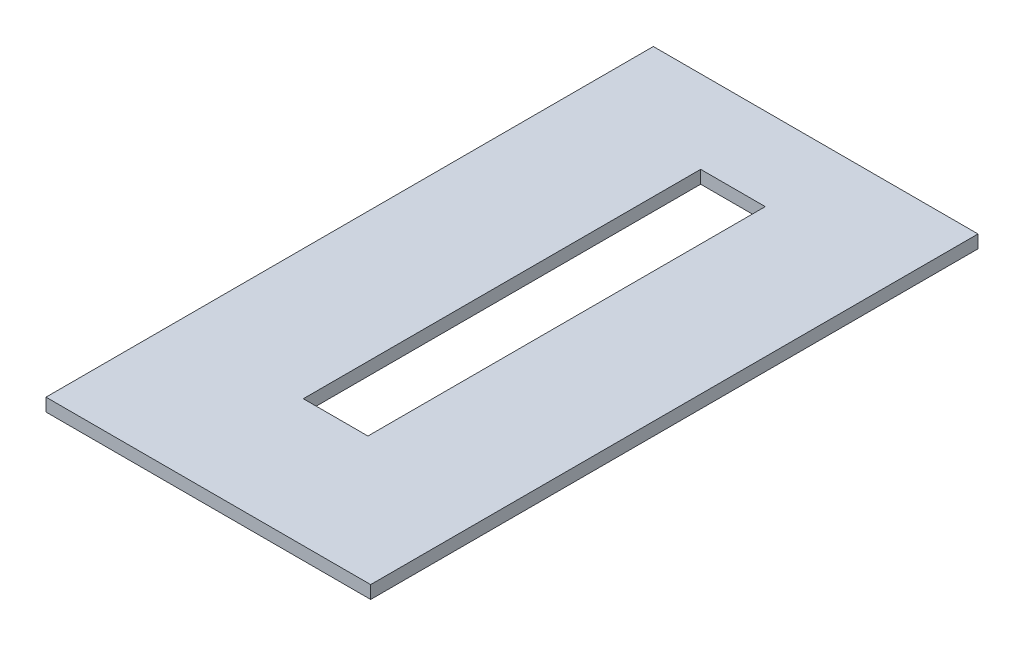
ISO-10303-21;
HEADER;
FILE_DESCRIPTION(('STEP AP214'),'2;1');
FILE_NAME('part.step','',(''),(''),'','','');
FILE_SCHEMA(('AUTOMOTIVE_DESIGN { 1 0 10303 214 1 1 1 1 }'));
ENDSEC;
DATA;
#1=APPLICATION_CONTEXT('core data for automotive mechanical design processes');
#2=APPLICATION_PROTOCOL_DEFINITION('international standard','automotive_design',2000,#1);
#3=PRODUCT_CONTEXT('',#1,'mechanical');
#4=PRODUCT('Part','Part','',(#3));
#5=PRODUCT_RELATED_PRODUCT_CATEGORY('part','',(#4));
#6=PRODUCT_DEFINITION_FORMATION('','',#4);
#7=PRODUCT_DEFINITION_CONTEXT('part definition',#1,'design');
#8=PRODUCT_DEFINITION('design','',#6,#7);
#9=PRODUCT_DEFINITION_SHAPE('','',#8);
#10=(LENGTH_UNIT() NAMED_UNIT(*) SI_UNIT(.MILLI.,.METRE.));
#11=(NAMED_UNIT(*) PLANE_ANGLE_UNIT() SI_UNIT($,.RADIAN.));
#12=(NAMED_UNIT(*) SI_UNIT($,.STERADIAN.) SOLID_ANGLE_UNIT());
#13=UNCERTAINTY_MEASURE_WITH_UNIT(LENGTH_MEASURE(1.E-05),#10,'distance_accuracy_value','');
#14=(GEOMETRIC_REPRESENTATION_CONTEXT(3) GLOBAL_UNCERTAINTY_ASSIGNED_CONTEXT((#13)) GLOBAL_UNIT_ASSIGNED_CONTEXT((#10,
#11,#12)) REPRESENTATION_CONTEXT('',''));
#15=CARTESIAN_POINT('',(0.,0.,0.));
#16=DIRECTION('',(0.,0.,1.));
#17=DIRECTION('',(1.,0.,0.));
#18=AXIS2_PLACEMENT_3D('',#15,#16,#17);
#19=CARTESIAN_POINT('',(-2512.49999999999,-10858.8285003559,4700.));
#20=DIRECTION('',(0.,0.,1.));
#21=DIRECTION('',(1.,0.,0.));
#22=AXIS2_PLACEMENT_3D('',#19,#20,#21);
#23=PLANE('',#22);
#24=DIRECTION('',(-1.,0.,0.));
#25=VECTOR('',#24,1.);
#26=CARTESIAN_POINT('',(-2512.49999999999,-199.999999999999,4700.));
#27=LINE('',#26,#25);
#28=CARTESIAN_POINT('',(2512.49999999999,-199.999999999999,4700.));
#29=VERTEX_POINT('',#28);
#30=CARTESIAN_POINT('',(-2512.49999999999,-199.999999999999,4700.));
#31=VERTEX_POINT('',#30);
#32=EDGE_CURVE('E11',#29,#31,#27,.T.);
#33=ORIENTED_EDGE('',*,*,#32,.F.);
#34=DIRECTION('',(0.,1.,0.));
#35=VECTOR('',#34,1.);
#36=CARTESIAN_POINT('',(2512.49999999999,-10858.8285003559,4700.));
#37=LINE('',#36,#35);
#38=CARTESIAN_POINT('',(2512.49999999999,0.,4700.));
#39=VERTEX_POINT('',#38);
#40=EDGE_CURVE('E145',#29,#39,#37,.T.);
#41=ORIENTED_EDGE('',*,*,#40,.T.);
#42=DIRECTION('',(1.,0.,0.));
#43=VECTOR('',#42,1.);
#44=CARTESIAN_POINT('',(-2512.49999999999,0.,4700.));
#45=LINE('',#44,#43);
#46=CARTESIAN_POINT('',(-2512.49999999999,0.,4700.));
#47=VERTEX_POINT('',#46);
#48=EDGE_CURVE('E131',#47,#39,#45,.T.);
#49=ORIENTED_EDGE('',*,*,#48,.F.);
#50=DIRECTION('',(0.,1.,0.));
#51=VECTOR('',#50,1.);
#52=CARTESIAN_POINT('',(-2512.49999999999,-10858.8285003559,4700.));
#53=LINE('',#52,#51);
#54=EDGE_CURVE('E140',#31,#47,#53,.T.);
#55=ORIENTED_EDGE('',*,*,#54,.F.);
#56=EDGE_LOOP('',(#33,#41,#49,#55));
#57=FACE_BOUND('',#56,.T.);
#58=ADVANCED_FACE('F35',(#57),#23,.T.);
#59=CARTESIAN_POINT('',(2512.49999999999,-10858.8285003559,-4700.));
#60=DIRECTION('',(1.,0.,0.));
#61=DIRECTION('',(0.,0.,-1.));
#62=AXIS2_PLACEMENT_3D('',#59,#60,#61);
#63=PLANE('',#62);
#64=DIRECTION('',(0.,0.,1.));
#65=VECTOR('',#64,1.);
#66=CARTESIAN_POINT('',(2512.49999999999,-199.999999999999,-4700.));
#67=LINE('',#66,#65);
#68=CARTESIAN_POINT('',(2512.49999999999,-199.999999999999,-4700.));
#69=VERTEX_POINT('',#68);
#70=EDGE_CURVE('E165',#69,#29,#67,.T.);
#71=ORIENTED_EDGE('',*,*,#70,.F.);
#72=DIRECTION('',(0.,1.,0.));
#73=VECTOR('',#72,1.);
#74=CARTESIAN_POINT('',(2512.49999999999,-10858.8285003559,-4700.));
#75=LINE('',#74,#73);
#76=CARTESIAN_POINT('',(2512.49999999999,0.,-4700.));
#77=VERTEX_POINT('',#76);
#78=EDGE_CURVE('E143',#69,#77,#75,.T.);
#79=ORIENTED_EDGE('',*,*,#78,.T.);
#80=DIRECTION('',(0.,0.,-1.));
#81=VECTOR('',#80,1.);
#82=CARTESIAN_POINT('',(2512.49999999999,0.,-4700.));
#83=LINE('',#82,#81);
#84=EDGE_CURVE('E134',#39,#77,#83,.T.);
#85=ORIENTED_EDGE('',*,*,#84,.F.);
#86=ORIENTED_EDGE('',*,*,#40,.F.);
#87=EDGE_LOOP('',(#71,#79,#85,#86));
#88=FACE_BOUND('',#87,.T.);
#89=ADVANCED_FACE('F190',(#88),#63,.T.);
#90=CARTESIAN_POINT('',(-2512.49999999999,-10858.8285003559,-4700.));
#91=DIRECTION('',(0.,0.,-1.));
#92=DIRECTION('',(-1.,0.,0.));
#93=AXIS2_PLACEMENT_3D('',#90,#91,#92);
#94=PLANE('',#93);
#95=DIRECTION('',(1.,0.,0.));
#96=VECTOR('',#95,1.);
#97=CARTESIAN_POINT('',(-2512.49999999999,-199.999999999999,-4700.));
#98=LINE('',#97,#96);
#99=CARTESIAN_POINT('',(-2512.49999999999,-199.999999999999,-4700.));
#100=VERTEX_POINT('',#99);
#101=EDGE_CURVE('E162',#100,#69,#98,.T.);
#102=ORIENTED_EDGE('',*,*,#101,.F.);
#103=DIRECTION('',(0.,1.,0.));
#104=VECTOR('',#103,1.);
#105=CARTESIAN_POINT('',(-2512.49999999999,-10858.8285003559,-4700.));
#106=LINE('',#105,#104);
#107=CARTESIAN_POINT('',(-2512.49999999999,0.,-4700.));
#108=VERTEX_POINT('',#107);
#109=EDGE_CURVE('E141',#100,#108,#106,.T.);
#110=ORIENTED_EDGE('',*,*,#109,.T.);
#111=DIRECTION('',(-1.,0.,0.));
#112=VECTOR('',#111,1.);
#113=CARTESIAN_POINT('',(-2512.49999999999,0.,-4700.));
#114=LINE('',#113,#112);
#115=EDGE_CURVE('E137',#77,#108,#114,.T.);
#116=ORIENTED_EDGE('',*,*,#115,.F.);
#117=ORIENTED_EDGE('',*,*,#78,.F.);
#118=EDGE_LOOP('',(#102,#110,#116,#117));
#119=FACE_BOUND('',#118,.T.);
#120=ADVANCED_FACE('F161',(#119),#94,.T.);
#121=CARTESIAN_POINT('',(-2512.49999999999,-10858.8285003559,-4700.));
#122=DIRECTION('',(-1.,0.,0.));
#123=DIRECTION('',(0.,0.,1.));
#124=AXIS2_PLACEMENT_3D('',#121,#122,#123);
#125=PLANE('',#124);
#126=DIRECTION('',(0.,0.,-1.));
#127=VECTOR('',#126,1.);
#128=CARTESIAN_POINT('',(-2512.49999999999,-199.999999999999,-4700.));
#129=LINE('',#128,#127);
#130=EDGE_CURVE('E152',#31,#100,#129,.T.);
#131=ORIENTED_EDGE('',*,*,#130,.F.);
#132=ORIENTED_EDGE('',*,*,#54,.T.);
#133=DIRECTION('',(0.,0.,1.));
#134=VECTOR('',#133,1.);
#135=CARTESIAN_POINT('',(-2512.49999999999,0.,-4700.));
#136=LINE('',#135,#134);
#137=EDGE_CURVE('E126',#108,#47,#136,.T.);
#138=ORIENTED_EDGE('',*,*,#137,.F.);
#139=ORIENTED_EDGE('',*,*,#109,.F.);
#140=EDGE_LOOP('',(#131,#132,#138,#139));
#141=FACE_BOUND('',#140,.T.);
#142=ADVANCED_FACE('F37',(#141),#125,.T.);
#143=CARTESIAN_POINT('',(0.,0.,0.));
#144=DIRECTION('',(0.,1.,0.));
#145=DIRECTION('',(0.,0.,1.));
#146=AXIS2_PLACEMENT_3D('',#143,#144,#145);
#147=PLANE('',#146);
#148=DIRECTION('',(0.,0.,1.));
#149=VECTOR('',#148,1.);
#150=CARTESIAN_POINT('',(-499.999999999778,0.,-3420.00000000009));
#151=LINE('',#150,#149);
#152=CARTESIAN_POINT('',(-499.999999999778,0.,-3420.00000000009));
#153=VERTEX_POINT('',#152);
#154=CARTESIAN_POINT('',(-499.999999999778,0.,2730.00000000002));
#155=VERTEX_POINT('',#154);
#156=EDGE_CURVE('E114',#153,#155,#151,.T.);
#157=ORIENTED_EDGE('',*,*,#156,.F.);
#158=DIRECTION('',(-1.,0.,0.));
#159=VECTOR('',#158,1.);
#160=CARTESIAN_POINT('',(-499.999999999778,0.,-3420.00000000009));
#161=LINE('',#160,#159);
#162=CARTESIAN_POINT('',(499.999999999992,0.,-3420.00000000009));
#163=VERTEX_POINT('',#162);
#164=EDGE_CURVE('E119',#163,#153,#161,.T.);
#165=ORIENTED_EDGE('',*,*,#164,.F.);
#166=DIRECTION('',(0.,0.,-1.));
#167=VECTOR('',#166,1.);
#168=CARTESIAN_POINT('',(499.999999999992,0.,-3420.00000000009));
#169=LINE('',#168,#167);
#170=CARTESIAN_POINT('',(499.999999999992,0.,2730.00000000002));
#171=VERTEX_POINT('',#170);
#172=EDGE_CURVE('E101',#171,#163,#169,.T.);
#173=ORIENTED_EDGE('',*,*,#172,.F.);
#174=DIRECTION('',(1.,0.,0.));
#175=VECTOR('',#174,1.);
#176=CARTESIAN_POINT('',(-499.999999999778,0.,2730.00000000002));
#177=LINE('',#176,#175);
#178=EDGE_CURVE('E108',#155,#171,#177,.T.);
#179=ORIENTED_EDGE('',*,*,#178,.F.);
#180=EDGE_LOOP('',(#157,#165,#173,#179));
#181=FACE_BOUND('',#180,.T.);
#182=ORIENTED_EDGE('',*,*,#137,.T.);
#183=ORIENTED_EDGE('',*,*,#48,.T.);
#184=ORIENTED_EDGE('',*,*,#84,.T.);
#185=ORIENTED_EDGE('',*,*,#115,.T.);
#186=EDGE_LOOP('',(#182,#183,#184,#185));
#187=FACE_BOUND('',#186,.T.);
#188=ADVANCED_FACE('F116',(#181,#187),#147,.T.);
#189=CARTESIAN_POINT('',(-499.999999999778,-10858.8285003559,2730.00000000002));
#190=DIRECTION('',(0.,0.,1.));
#191=DIRECTION('',(1.,0.,0.));
#192=AXIS2_PLACEMENT_3D('',#189,#190,#191);
#193=PLANE('',#192);
#194=DIRECTION('',(0.,1.,0.));
#195=VECTOR('',#194,1.);
#196=CARTESIAN_POINT('',(499.999999999992,-10858.8285003559,2730.00000000002));
#197=LINE('',#196,#195);
#198=CARTESIAN_POINT('',(499.999999999991,-199.999999999999,2730.00000000002));
#199=VERTEX_POINT('',#198);
#200=EDGE_CURVE('E97',#199,#171,#197,.T.);
#201=ORIENTED_EDGE('',*,*,#200,.F.);
#202=DIRECTION('',(-1.,0.,0.));
#203=VECTOR('',#202,1.);
#204=CARTESIAN_POINT('',(-499.999999999778,-199.999999999999,2730.00000000002));
#205=LINE('',#204,#203);
#206=CARTESIAN_POINT('',(-499.999999999778,-199.999999999999,2730.00000000002));
#207=VERTEX_POINT('',#206);
#208=EDGE_CURVE('E39',#199,#207,#205,.T.);
#209=ORIENTED_EDGE('',*,*,#208,.T.);
#210=DIRECTION('',(0.,1.,0.));
#211=VECTOR('',#210,1.);
#212=CARTESIAN_POINT('',(-499.999999999778,-10858.8285003559,2730.00000000002));
#213=LINE('',#212,#211);
#214=EDGE_CURVE('E105',#207,#155,#213,.T.);
#215=ORIENTED_EDGE('',*,*,#214,.T.);
#216=ORIENTED_EDGE('',*,*,#178,.T.);
#217=EDGE_LOOP('',(#201,#209,#215,#216));
#218=FACE_BOUND('',#217,.T.);
#219=ADVANCED_FACE('F109',(#218),#193,.F.);
#220=CARTESIAN_POINT('',(499.999999999992,-10858.8285003559,-3420.00000000009));
#221=DIRECTION('',(1.,0.,0.));
#222=DIRECTION('',(0.,0.,-1.));
#223=AXIS2_PLACEMENT_3D('',#220,#221,#222);
#224=PLANE('',#223);
#225=DIRECTION('',(0.,1.,0.));
#226=VECTOR('',#225,1.);
#227=CARTESIAN_POINT('',(499.999999999992,-10858.8285003559,-3420.00000000009));
#228=LINE('',#227,#226);
#229=CARTESIAN_POINT('',(499.999999999992,-199.999999999999,-3420.00000000009));
#230=VERTEX_POINT('',#229);
#231=EDGE_CURVE('E104',#230,#163,#228,.T.);
#232=ORIENTED_EDGE('',*,*,#231,.F.);
#233=DIRECTION('',(0.,0.,1.));
#234=VECTOR('',#233,1.);
#235=CARTESIAN_POINT('',(499.999999999992,-199.999999999999,-3420.00000000009));
#236=LINE('',#235,#234);
#237=EDGE_CURVE('E44',#230,#199,#236,.T.);
#238=ORIENTED_EDGE('',*,*,#237,.T.);
#239=ORIENTED_EDGE('',*,*,#200,.T.);
#240=ORIENTED_EDGE('',*,*,#172,.T.);
#241=EDGE_LOOP('',(#232,#238,#239,#240));
#242=FACE_BOUND('',#241,.T.);
#243=ADVANCED_FACE('F99',(#242),#224,.F.);
#244=CARTESIAN_POINT('',(-499.999999999778,-10858.8285003559,-3420.00000000009));
#245=DIRECTION('',(0.,0.,-1.));
#246=DIRECTION('',(-1.,0.,0.));
#247=AXIS2_PLACEMENT_3D('',#244,#245,#246);
#248=PLANE('',#247);
#249=DIRECTION('',(0.,1.,0.));
#250=VECTOR('',#249,1.);
#251=CARTESIAN_POINT('',(-499.999999999778,-10858.8285003559,-3420.00000000009));
#252=LINE('',#251,#250);
#253=CARTESIAN_POINT('',(-499.999999999778,-199.999999999999,-3420.00000000009));
#254=VERTEX_POINT('',#253);
#255=EDGE_CURVE('E124',#254,#153,#252,.T.);
#256=ORIENTED_EDGE('',*,*,#255,.F.);
#257=DIRECTION('',(1.,0.,0.));
#258=VECTOR('',#257,1.);
#259=CARTESIAN_POINT('',(-499.999999999778,-199.999999999999,-3420.00000000009));
#260=LINE('',#259,#258);
#261=EDGE_CURVE('E177',#254,#230,#260,.T.);
#262=ORIENTED_EDGE('',*,*,#261,.T.);
#263=ORIENTED_EDGE('',*,*,#231,.T.);
#264=ORIENTED_EDGE('',*,*,#164,.T.);
#265=EDGE_LOOP('',(#256,#262,#263,#264));
#266=FACE_BOUND('',#265,.T.);
#267=ADVANCED_FACE('F176',(#266),#248,.F.);
#268=CARTESIAN_POINT('',(-499.999999999778,-10858.8285003559,-3420.00000000009));
#269=DIRECTION('',(-1.,0.,0.));
#270=DIRECTION('',(0.,0.,1.));
#271=AXIS2_PLACEMENT_3D('',#268,#269,#270);
#272=PLANE('',#271);
#273=ORIENTED_EDGE('',*,*,#214,.F.);
#274=DIRECTION('',(0.,0.,-1.));
#275=VECTOR('',#274,1.);
#276=CARTESIAN_POINT('',(-499.999999999778,-199.999999999999,-3420.00000000009));
#277=LINE('',#276,#275);
#278=EDGE_CURVE('E167',#207,#254,#277,.T.);
#279=ORIENTED_EDGE('',*,*,#278,.T.);
#280=ORIENTED_EDGE('',*,*,#255,.T.);
#281=ORIENTED_EDGE('',*,*,#156,.T.);
#282=EDGE_LOOP('',(#273,#279,#280,#281));
#283=FACE_BOUND('',#282,.T.);
#284=ADVANCED_FACE('F171',(#283),#272,.F.);
#285=CARTESIAN_POINT('',(-7.54951656745106E-12,-200.,-2.66453525910038E-12));
#286=DIRECTION('',(0.,1.,0.));
#287=DIRECTION('',(0.,0.,1.));
#288=AXIS2_PLACEMENT_3D('',#285,#286,#287);
#289=PLANE('',#288);
#290=ORIENTED_EDGE('',*,*,#130,.T.);
#291=ORIENTED_EDGE('',*,*,#101,.T.);
#292=ORIENTED_EDGE('',*,*,#70,.T.);
#293=ORIENTED_EDGE('',*,*,#32,.T.);
#294=EDGE_LOOP('',(#290,#291,#292,#293));
#295=FACE_BOUND('',#294,.T.);
#296=ORIENTED_EDGE('',*,*,#208,.F.);
#297=ORIENTED_EDGE('',*,*,#237,.F.);
#298=ORIENTED_EDGE('',*,*,#261,.F.);
#299=ORIENTED_EDGE('',*,*,#278,.F.);
#300=EDGE_LOOP('',(#296,#297,#298,#299));
#301=FACE_BOUND('',#300,.T.);
#302=ADVANCED_FACE('F181',(#295,#301),#289,.F.);
#303=CLOSED_SHELL('',(#58,#89,#120,#142,#188,#219,#243,#267,#284,#302));
#304=MANIFOLD_SOLID_BREP('B2',#303);
#305=ADVANCED_BREP_SHAPE_REPRESENTATION('',(#18,#304),#14);
#306=SHAPE_DEFINITION_REPRESENTATION(#9,#305);
ENDSEC;
END-ISO-10303-21;
